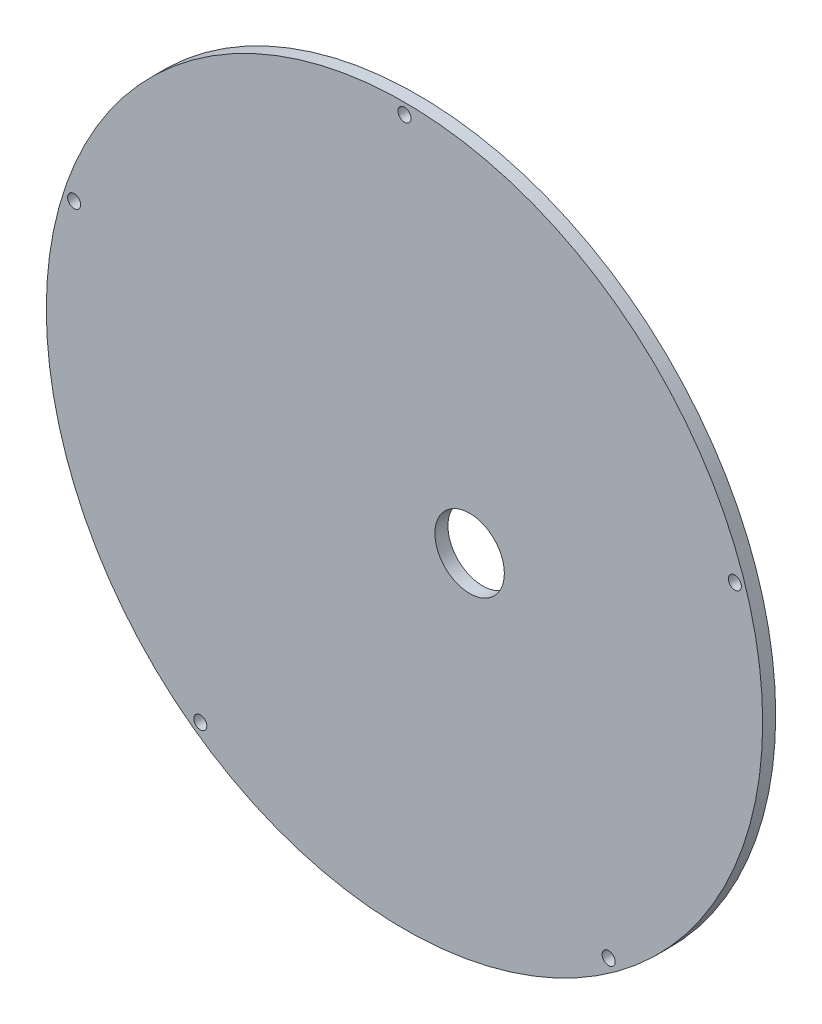
ISO-10303-21;
HEADER;
FILE_DESCRIPTION(('STEP AP214'),'2;1');
FILE_NAME('part.step','',(''),(''),'','','');
FILE_SCHEMA(('AUTOMOTIVE_DESIGN { 1 0 10303 214 1 1 1 1 }'));
ENDSEC;
DATA;
#1=APPLICATION_CONTEXT('core data for automotive mechanical design processes');
#2=APPLICATION_PROTOCOL_DEFINITION('international standard','automotive_design',2000,#1);
#3=PRODUCT_CONTEXT('',#1,'mechanical');
#4=PRODUCT('Part','Part','',(#3));
#5=PRODUCT_RELATED_PRODUCT_CATEGORY('part','',(#4));
#6=PRODUCT_DEFINITION_FORMATION('','',#4);
#7=PRODUCT_DEFINITION_CONTEXT('part definition',#1,'design');
#8=PRODUCT_DEFINITION('design','',#6,#7);
#9=PRODUCT_DEFINITION_SHAPE('','',#8);
#10=(LENGTH_UNIT() NAMED_UNIT(*) SI_UNIT(.MILLI.,.METRE.));
#11=(NAMED_UNIT(*) PLANE_ANGLE_UNIT() SI_UNIT($,.RADIAN.));
#12=(NAMED_UNIT(*) SI_UNIT($,.STERADIAN.) SOLID_ANGLE_UNIT());
#13=UNCERTAINTY_MEASURE_WITH_UNIT(LENGTH_MEASURE(1.E-05),#10,'distance_accuracy_value','');
#14=(GEOMETRIC_REPRESENTATION_CONTEXT(3) GLOBAL_UNCERTAINTY_ASSIGNED_CONTEXT((#13)) GLOBAL_UNIT_ASSIGNED_CONTEXT((#10,
#11,#12)) REPRESENTATION_CONTEXT('',''));
#15=CARTESIAN_POINT('',(0.,0.,0.));
#16=DIRECTION('',(0.,0.,1.));
#17=DIRECTION('',(1.,0.,0.));
#18=AXIS2_PLACEMENT_3D('',#15,#16,#17);
#19=CARTESIAN_POINT('',(0.,0.,3.));
#20=DIRECTION('',(0.,0.,-1.));
#21=DIRECTION('',(-1.,0.,0.));
#22=AXIS2_PLACEMENT_3D('',#19,#20,#21);
#23=CYLINDRICAL_SURFACE('',#22,82.5);
#24=CARTESIAN_POINT('',(0.,0.,3.));
#25=DIRECTION('',(0.,0.,1.));
#26=DIRECTION('',(1.,0.,0.));
#27=AXIS2_PLACEMENT_3D('',#24,#25,#26);
#28=CIRCLE('',#27,82.5);
#29=CARTESIAN_POINT('',(82.5,0.,3.));
#30=VERTEX_POINT('',#29);
#31=EDGE_CURVE('E10',#30,#30,#28,.T.);
#32=ORIENTED_EDGE('',*,*,#31,.F.);
#33=EDGE_LOOP('',(#32));
#34=FACE_BOUND('',#33,.T.);
#35=CARTESIAN_POINT('',(0.,0.,0.));
#36=DIRECTION('',(0.,0.,1.));
#37=DIRECTION('',(1.,0.,0.));
#38=AXIS2_PLACEMENT_3D('',#35,#36,#37);
#39=CIRCLE('',#38,82.5);
#40=CARTESIAN_POINT('',(82.5,0.,0.));
#41=VERTEX_POINT('',#40);
#42=EDGE_CURVE('E33',#41,#41,#39,.T.);
#43=ORIENTED_EDGE('',*,*,#42,.T.);
#44=EDGE_LOOP('',(#43));
#45=FACE_BOUND('',#44,.T.);
#46=ADVANCED_FACE('F30',(#34,#45),#23,.T.);
#47=CARTESIAN_POINT('',(0.,0.,3.));
#48=DIRECTION('',(0.,0.,1.));
#49=DIRECTION('',(1.,0.,0.));
#50=AXIS2_PLACEMENT_3D('',#47,#48,#49);
#51=PLANE('',#50);
#52=CARTESIAN_POINT('',(15.,0.,3.));
#53=DIRECTION('',(0.,0.,1.));
#54=DIRECTION('',(1.,0.,0.));
#55=AXIS2_PLACEMENT_3D('',#52,#53,#54);
#56=CIRCLE('',#55,8.);
#57=CARTESIAN_POINT('',(23.,0.,3.));
#58=VERTEX_POINT('',#57);
#59=EDGE_CURVE('E72',#58,#58,#56,.T.);
#60=ORIENTED_EDGE('',*,*,#59,.F.);
#61=EDGE_LOOP('',(#60));
#62=FACE_BOUND('',#61,.T.);
#63=CARTESIAN_POINT('',(76.084521303612,24.7213595499967,3.));
#64=DIRECTION('',(0.,0.,1.));
#65=DIRECTION('',(1.,0.,0.));
#66=AXIS2_PLACEMENT_3D('',#63,#64,#65);
#67=CIRCLE('',#66,1.49999999999999);
#68=CARTESIAN_POINT('',(77.584521303612,24.7213595499967,3.));
#69=VERTEX_POINT('',#68);
#70=EDGE_CURVE('E68',#69,#69,#67,.T.);
#71=ORIENTED_EDGE('',*,*,#70,.F.);
#72=EDGE_LOOP('',(#71));
#73=FACE_BOUND('',#72,.T.);
#74=CARTESIAN_POINT('',(47.0228201833984,-64.7213595499954,3.));
#75=DIRECTION('',(0.,0.,1.));
#76=DIRECTION('',(1.,0.,0.));
#77=AXIS2_PLACEMENT_3D('',#74,#75,#76);
#78=CIRCLE('',#77,1.49999999999999);
#79=CARTESIAN_POINT('',(48.5228201833984,-64.7213595499954,3.));
#80=VERTEX_POINT('',#79);
#81=EDGE_CURVE('E62',#80,#80,#78,.T.);
#82=ORIENTED_EDGE('',*,*,#81,.F.);
#83=EDGE_LOOP('',(#82));
#84=FACE_BOUND('',#83,.T.);
#85=CARTESIAN_POINT('',(-47.0228201833975,-64.7213595499961,3.));
#86=DIRECTION('',(0.,0.,1.));
#87=DIRECTION('',(1.,0.,0.));
#88=AXIS2_PLACEMENT_3D('',#85,#86,#87);
#89=CIRCLE('',#88,1.49999999999999);
#90=CARTESIAN_POINT('',(-45.5228201833975,-64.7213595499961,3.));
#91=VERTEX_POINT('',#90);
#92=EDGE_CURVE('E56',#91,#91,#89,.T.);
#93=ORIENTED_EDGE('',*,*,#92,.F.);
#94=EDGE_LOOP('',(#93));
#95=FACE_BOUND('',#94,.T.);
#96=CARTESIAN_POINT('',(-76.0845213036124,24.7213595499956,3.));
#97=DIRECTION('',(0.,0.,1.));
#98=DIRECTION('',(1.,0.,0.));
#99=AXIS2_PLACEMENT_3D('',#96,#97,#98);
#100=CIRCLE('',#99,1.49999999999999);
#101=CARTESIAN_POINT('',(-74.5845213036124,24.7213595499956,3.));
#102=VERTEX_POINT('',#101);
#103=EDGE_CURVE('E50',#102,#102,#100,.T.);
#104=ORIENTED_EDGE('',*,*,#103,.F.);
#105=EDGE_LOOP('',(#104));
#106=FACE_BOUND('',#105,.T.);
#107=CARTESIAN_POINT('',(0.,80.,3.));
#108=DIRECTION('',(0.,0.,1.));
#109=DIRECTION('',(1.,0.,0.));
#110=AXIS2_PLACEMENT_3D('',#107,#108,#109);
#111=CIRCLE('',#110,1.49999999999999);
#112=CARTESIAN_POINT('',(1.49999999999999,80.,3.));
#113=VERTEX_POINT('',#112);
#114=EDGE_CURVE('E44',#113,#113,#111,.T.);
#115=ORIENTED_EDGE('',*,*,#114,.F.);
#116=EDGE_LOOP('',(#115));
#117=FACE_BOUND('',#116,.T.);
#118=ORIENTED_EDGE('',*,*,#31,.T.);
#119=EDGE_LOOP('',(#118));
#120=FACE_BOUND('',#119,.T.);
#121=ADVANCED_FACE('F88',(#62,#73,#84,#95,#106,#117,#120),#51,.T.);
#122=CARTESIAN_POINT('',(0.,0.,0.));
#123=DIRECTION('',(0.,0.,1.));
#124=DIRECTION('',(1.,0.,0.));
#125=AXIS2_PLACEMENT_3D('',#122,#123,#124);
#126=PLANE('',#125);
#127=CARTESIAN_POINT('',(15.,0.,0.));
#128=DIRECTION('',(0.,0.,1.));
#129=DIRECTION('',(1.,0.,0.));
#130=AXIS2_PLACEMENT_3D('',#127,#128,#129);
#131=CIRCLE('',#130,8.);
#132=CARTESIAN_POINT('',(23.,0.,0.));
#133=VERTEX_POINT('',#132);
#134=EDGE_CURVE('E71',#133,#133,#131,.T.);
#135=ORIENTED_EDGE('',*,*,#134,.T.);
#136=EDGE_LOOP('',(#135));
#137=FACE_BOUND('',#136,.T.);
#138=CARTESIAN_POINT('',(76.084521303612,24.7213595499967,0.));
#139=DIRECTION('',(0.,0.,1.));
#140=DIRECTION('',(1.,0.,0.));
#141=AXIS2_PLACEMENT_3D('',#138,#139,#140);
#142=CIRCLE('',#141,1.5);
#143=CARTESIAN_POINT('',(77.584521303612,24.7213595499967,0.));
#144=VERTEX_POINT('',#143);
#145=EDGE_CURVE('E65',#144,#144,#142,.T.);
#146=ORIENTED_EDGE('',*,*,#145,.T.);
#147=EDGE_LOOP('',(#146));
#148=FACE_BOUND('',#147,.T.);
#149=CARTESIAN_POINT('',(47.0228201833984,-64.7213595499954,0.));
#150=DIRECTION('',(0.,0.,1.));
#151=DIRECTION('',(1.,0.,0.));
#152=AXIS2_PLACEMENT_3D('',#149,#150,#151);
#153=CIRCLE('',#152,1.5);
#154=CARTESIAN_POINT('',(48.5228201833984,-64.7213595499954,0.));
#155=VERTEX_POINT('',#154);
#156=EDGE_CURVE('E59',#155,#155,#153,.T.);
#157=ORIENTED_EDGE('',*,*,#156,.T.);
#158=EDGE_LOOP('',(#157));
#159=FACE_BOUND('',#158,.T.);
#160=CARTESIAN_POINT('',(-47.0228201833975,-64.7213595499961,0.));
#161=DIRECTION('',(0.,0.,1.));
#162=DIRECTION('',(1.,0.,0.));
#163=AXIS2_PLACEMENT_3D('',#160,#161,#162);
#164=CIRCLE('',#163,1.5);
#165=CARTESIAN_POINT('',(-45.5228201833975,-64.7213595499961,0.));
#166=VERTEX_POINT('',#165);
#167=EDGE_CURVE('E53',#166,#166,#164,.T.);
#168=ORIENTED_EDGE('',*,*,#167,.T.);
#169=EDGE_LOOP('',(#168));
#170=FACE_BOUND('',#169,.T.);
#171=CARTESIAN_POINT('',(-76.0845213036124,24.7213595499956,0.));
#172=DIRECTION('',(0.,0.,1.));
#173=DIRECTION('',(1.,0.,0.));
#174=AXIS2_PLACEMENT_3D('',#171,#172,#173);
#175=CIRCLE('',#174,1.5);
#176=CARTESIAN_POINT('',(-74.5845213036124,24.7213595499956,0.));
#177=VERTEX_POINT('',#176);
#178=EDGE_CURVE('E47',#177,#177,#175,.T.);
#179=ORIENTED_EDGE('',*,*,#178,.T.);
#180=EDGE_LOOP('',(#179));
#181=FACE_BOUND('',#180,.T.);
#182=CARTESIAN_POINT('',(0.,80.,0.));
#183=DIRECTION('',(0.,0.,1.));
#184=DIRECTION('',(1.,0.,0.));
#185=AXIS2_PLACEMENT_3D('',#182,#183,#184);
#186=CIRCLE('',#185,1.5);
#187=CARTESIAN_POINT('',(1.5,80.,0.));
#188=VERTEX_POINT('',#187);
#189=EDGE_CURVE('E40',#188,#188,#186,.T.);
#190=ORIENTED_EDGE('',*,*,#189,.T.);
#191=EDGE_LOOP('',(#190));
#192=FACE_BOUND('',#191,.T.);
#193=ORIENTED_EDGE('',*,*,#42,.F.);
#194=EDGE_LOOP('',(#193));
#195=FACE_BOUND('',#194,.T.);
#196=ADVANCED_FACE('F78',(#137,#148,#159,#170,#181,#192,#195),#126,.F.);
#197=CARTESIAN_POINT('',(0.,80.,3.));
#198=DIRECTION('',(0.,0.,1.));
#199=DIRECTION('',(1.,0.,0.));
#200=AXIS2_PLACEMENT_3D('',#197,#198,#199);
#201=CYLINDRICAL_SURFACE('',#200,1.49999999999999);
#202=ORIENTED_EDGE('',*,*,#189,.F.);
#203=EDGE_LOOP('',(#202));
#204=FACE_BOUND('',#203,.T.);
#205=ORIENTED_EDGE('',*,*,#114,.T.);
#206=EDGE_LOOP('',(#205));
#207=FACE_BOUND('',#206,.T.);
#208=ADVANCED_FACE('F102',(#204,#207),#201,.F.);
#209=CARTESIAN_POINT('',(-76.0845213036124,24.7213595499956,3.));
#210=DIRECTION('',(0.,0.,1.));
#211=DIRECTION('',(1.,0.,0.));
#212=AXIS2_PLACEMENT_3D('',#209,#210,#211);
#213=CYLINDRICAL_SURFACE('',#212,1.49999999999999);
#214=ORIENTED_EDGE('',*,*,#178,.F.);
#215=EDGE_LOOP('',(#214));
#216=FACE_BOUND('',#215,.T.);
#217=ORIENTED_EDGE('',*,*,#103,.T.);
#218=EDGE_LOOP('',(#217));
#219=FACE_BOUND('',#218,.T.);
#220=ADVANCED_FACE('F104',(#216,#219),#213,.F.);
#221=CARTESIAN_POINT('',(-47.0228201833975,-64.7213595499961,3.));
#222=DIRECTION('',(0.,0.,1.));
#223=DIRECTION('',(1.,0.,0.));
#224=AXIS2_PLACEMENT_3D('',#221,#222,#223);
#225=CYLINDRICAL_SURFACE('',#224,1.49999999999999);
#226=ORIENTED_EDGE('',*,*,#167,.F.);
#227=EDGE_LOOP('',(#226));
#228=FACE_BOUND('',#227,.T.);
#229=ORIENTED_EDGE('',*,*,#92,.T.);
#230=EDGE_LOOP('',(#229));
#231=FACE_BOUND('',#230,.T.);
#232=ADVANCED_FACE('F111',(#228,#231),#225,.F.);
#233=CARTESIAN_POINT('',(47.0228201833984,-64.7213595499954,3.));
#234=DIRECTION('',(0.,0.,1.));
#235=DIRECTION('',(1.,0.,0.));
#236=AXIS2_PLACEMENT_3D('',#233,#234,#235);
#237=CYLINDRICAL_SURFACE('',#236,1.49999999999999);
#238=ORIENTED_EDGE('',*,*,#156,.F.);
#239=EDGE_LOOP('',(#238));
#240=FACE_BOUND('',#239,.T.);
#241=ORIENTED_EDGE('',*,*,#81,.T.);
#242=EDGE_LOOP('',(#241));
#243=FACE_BOUND('',#242,.T.);
#244=ADVANCED_FACE('F146',(#240,#243),#237,.F.);
#245=CARTESIAN_POINT('',(76.084521303612,24.7213595499967,3.));
#246=DIRECTION('',(0.,0.,1.));
#247=DIRECTION('',(1.,0.,0.));
#248=AXIS2_PLACEMENT_3D('',#245,#246,#247);
#249=CYLINDRICAL_SURFACE('',#248,1.49999999999999);
#250=ORIENTED_EDGE('',*,*,#145,.F.);
#251=EDGE_LOOP('',(#250));
#252=FACE_BOUND('',#251,.T.);
#253=ORIENTED_EDGE('',*,*,#70,.T.);
#254=EDGE_LOOP('',(#253));
#255=FACE_BOUND('',#254,.T.);
#256=ADVANCED_FACE('F84',(#252,#255),#249,.F.);
#257=CARTESIAN_POINT('',(15.,0.,0.));
#258=DIRECTION('',(0.,0.,1.));
#259=DIRECTION('',(1.,0.,0.));
#260=AXIS2_PLACEMENT_3D('',#257,#258,#259);
#261=CYLINDRICAL_SURFACE('',#260,8.);
#262=ORIENTED_EDGE('',*,*,#134,.F.);
#263=EDGE_LOOP('',(#262));
#264=FACE_BOUND('',#263,.T.);
#265=ORIENTED_EDGE('',*,*,#59,.T.);
#266=EDGE_LOOP('',(#265));
#267=FACE_BOUND('',#266,.T.);
#268=ADVANCED_FACE('F81',(#264,#267),#261,.F.);
#269=CLOSED_SHELL('',(#46,#121,#196,#208,#220,#232,#244,#256,#268));
#270=MANIFOLD_SOLID_BREP('B2',#269);
#271=ADVANCED_BREP_SHAPE_REPRESENTATION('',(#18,#270),#14);
#272=SHAPE_DEFINITION_REPRESENTATION(#9,#271);
ENDSEC;
END-ISO-10303-21;
